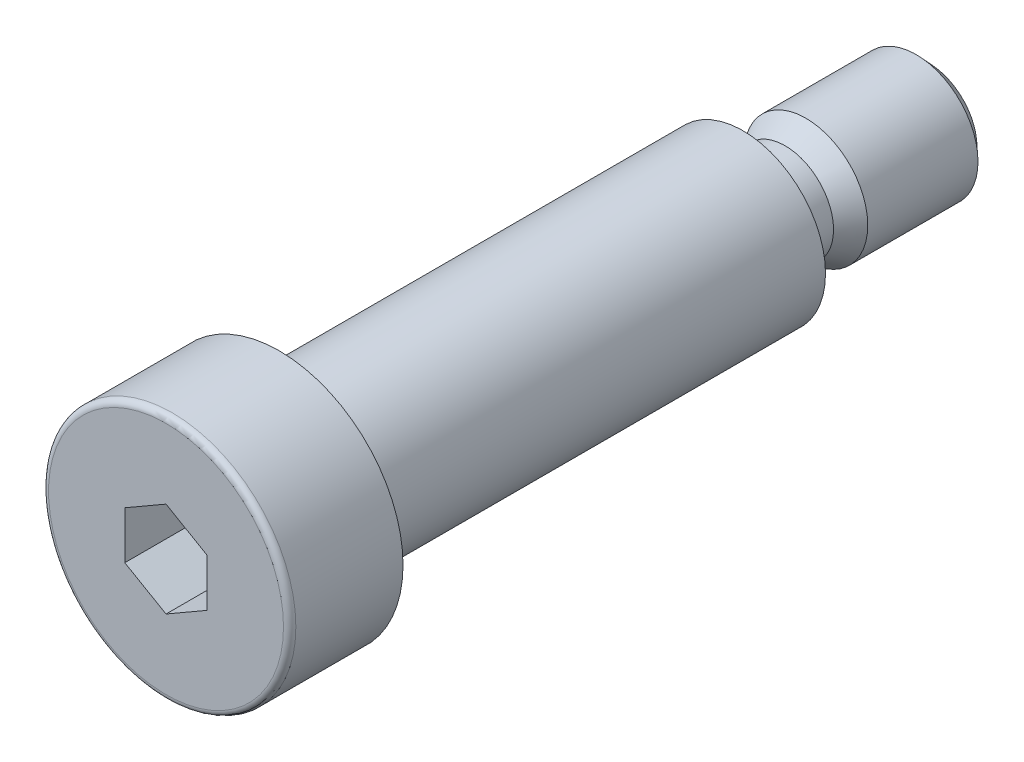
ISO-10303-21;
HEADER;
FILE_DESCRIPTION(('STEP AP214'),'2;1');
FILE_NAME('part.step','',(''),(''),'','','');
FILE_SCHEMA(('AUTOMOTIVE_DESIGN { 1 0 10303 214 1 1 1 1 }'));
ENDSEC;
DATA;
#1=APPLICATION_CONTEXT('core data for automotive mechanical design processes');
#2=APPLICATION_PROTOCOL_DEFINITION('international standard','automotive_design',2000,#1);
#3=PRODUCT_CONTEXT('',#1,'mechanical');
#4=PRODUCT('Part','Part','',(#3));
#5=PRODUCT_RELATED_PRODUCT_CATEGORY('part','',(#4));
#6=PRODUCT_DEFINITION_FORMATION('','',#4);
#7=PRODUCT_DEFINITION_CONTEXT('part definition',#1,'design');
#8=PRODUCT_DEFINITION('design','',#6,#7);
#9=PRODUCT_DEFINITION_SHAPE('','',#8);
#10=(LENGTH_UNIT() NAMED_UNIT(*) SI_UNIT(.MILLI.,.METRE.));
#11=(NAMED_UNIT(*) PLANE_ANGLE_UNIT() SI_UNIT($,.RADIAN.));
#12=(NAMED_UNIT(*) SI_UNIT($,.STERADIAN.) SOLID_ANGLE_UNIT());
#13=UNCERTAINTY_MEASURE_WITH_UNIT(LENGTH_MEASURE(1.E-05),#10,'distance_accuracy_value','');
#14=(GEOMETRIC_REPRESENTATION_CONTEXT(3) GLOBAL_UNCERTAINTY_ASSIGNED_CONTEXT((#13)) GLOBAL_UNIT_ASSIGNED_CONTEXT((#10,
#11,#12)) REPRESENTATION_CONTEXT('',''));
#15=CARTESIAN_POINT('',(0.,0.,0.));
#16=DIRECTION('',(0.,0.,1.));
#17=DIRECTION('',(1.,0.,0.));
#18=AXIS2_PLACEMENT_3D('',#15,#16,#17);
#19=CARTESIAN_POINT('',(0.,0.,33.5));
#20=DIRECTION('',(0.,0.,1.));
#21=DIRECTION('',(1.,0.,0.));
#22=AXIS2_PLACEMENT_3D('',#19,#20,#21);
#23=PLANE('',#22);
#24=CARTESIAN_POINT('',(0.,0.,33.5));
#25=DIRECTION('',(0.,0.,1.));
#26=DIRECTION('',(1.,0.,0.));
#27=AXIS2_PLACEMENT_3D('',#24,#25,#26);
#28=CIRCLE('',#27,11.4);
#29=CARTESIAN_POINT('',(11.4,0.,33.5));
#30=VERTEX_POINT('',#29);
#31=EDGE_CURVE('E42',#30,#30,#28,.T.);
#32=ORIENTED_EDGE('',*,*,#31,.T.);
#33=EDGE_LOOP('',(#32));
#34=FACE_BOUND('',#33,.T.);
#35=DIRECTION('',(0.,1.,0.));
#36=VECTOR('',#35,1.);
#37=CARTESIAN_POINT('',(4.,-2.30940107675851,33.5));
#38=LINE('',#37,#36);
#39=CARTESIAN_POINT('',(4.,-2.30940107675851,33.5));
#40=VERTEX_POINT('',#39);
#41=CARTESIAN_POINT('',(4.,2.3094010767585,33.5));
#42=VERTEX_POINT('',#41);
#43=EDGE_CURVE('E49',#40,#42,#38,.T.);
#44=ORIENTED_EDGE('',*,*,#43,.F.);
#45=DIRECTION('',(0.866025403784439,0.5,0.));
#46=VECTOR('',#45,1.);
#47=CARTESIAN_POINT('',(0.,-4.61880215351701,33.5));
#48=LINE('',#47,#46);
#49=CARTESIAN_POINT('',(0.,-4.61880215351701,33.5));
#50=VERTEX_POINT('',#49);
#51=EDGE_CURVE('E132',#50,#40,#48,.T.);
#52=ORIENTED_EDGE('',*,*,#51,.F.);
#53=DIRECTION('',(0.866025403784439,-0.5,0.));
#54=VECTOR('',#53,1.);
#55=CARTESIAN_POINT('',(-4.,-2.3094010767585,33.5));
#56=LINE('',#55,#54);
#57=CARTESIAN_POINT('',(-4.,-2.3094010767585,33.5));
#58=VERTEX_POINT('',#57);
#59=EDGE_CURVE('E130',#58,#50,#56,.T.);
#60=ORIENTED_EDGE('',*,*,#59,.F.);
#61=DIRECTION('',(0.,-1.,0.));
#62=VECTOR('',#61,1.);
#63=CARTESIAN_POINT('',(-4.,2.30940107675851,33.5));
#64=LINE('',#63,#62);
#65=CARTESIAN_POINT('',(-4.,2.30940107675851,33.5));
#66=VERTEX_POINT('',#65);
#67=EDGE_CURVE('E97',#66,#58,#64,.T.);
#68=ORIENTED_EDGE('',*,*,#67,.F.);
#69=DIRECTION('',(-0.866025403784439,-0.5,0.));
#70=VECTOR('',#69,1.);
#71=CARTESIAN_POINT('',(0.,4.61880215351701,33.5));
#72=LINE('',#71,#70);
#73=CARTESIAN_POINT('',(0.,4.61880215351701,33.5));
#74=VERTEX_POINT('',#73);
#75=EDGE_CURVE('E126',#74,#66,#72,.T.);
#76=ORIENTED_EDGE('',*,*,#75,.F.);
#77=DIRECTION('',(-0.866025403784439,0.5,0.));
#78=VECTOR('',#77,1.);
#79=CARTESIAN_POINT('',(4.,2.3094010767585,33.5));
#80=LINE('',#79,#78);
#81=EDGE_CURVE('E123',#42,#74,#80,.T.);
#82=ORIENTED_EDGE('',*,*,#81,.F.);
#83=EDGE_LOOP('',(#44,#52,#60,#68,#76,#82));
#84=FACE_BOUND('',#83,.T.);
#85=ADVANCED_FACE('F34',(#34,#84),#23,.T.);
#86=CARTESIAN_POINT('',(0.,0.,-40.5));
#87=DIRECTION('',(0.,0.,1.));
#88=DIRECTION('',(1.,0.,0.));
#89=AXIS2_PLACEMENT_3D('',#86,#87,#88);
#90=PLANE('',#89);
#91=CARTESIAN_POINT('',(0.,0.,-40.5));
#92=DIRECTION('',(0.,0.,1.));
#93=DIRECTION('',(1.,0.,0.));
#94=AXIS2_PLACEMENT_3D('',#91,#92,#93);
#95=CIRCLE('',#94,4.7);
#96=CARTESIAN_POINT('',(4.7,0.,-40.5));
#97=VERTEX_POINT('',#96);
#98=EDGE_CURVE('E162',#97,#97,#95,.T.);
#99=ORIENTED_EDGE('',*,*,#98,.F.);
#100=EDGE_LOOP('',(#99));
#101=FACE_BOUND('',#100,.T.);
#102=ADVANCED_FACE('F178',(#101),#90,.F.);
#103=CARTESIAN_POINT('',(0.,0.,-40.5));
#104=DIRECTION('',(0.,0.,1.));
#105=DIRECTION('',(1.,0.,0.));
#106=AXIS2_PLACEMENT_3D('',#103,#104,#105);
#107=CONICAL_SURFACE('',#106,4.7,0.825376850520735);
#108=CARTESIAN_POINT('',(0.,0.,-39.3));
#109=DIRECTION('',(0.,0.,1.));
#110=DIRECTION('',(1.,0.,0.));
#111=AXIS2_PLACEMENT_3D('',#108,#109,#110);
#112=CIRCLE('',#111,6.);
#113=CARTESIAN_POINT('',(6.,0.,-39.3));
#114=VERTEX_POINT('',#113);
#115=EDGE_CURVE('E159',#114,#114,#112,.T.);
#116=ORIENTED_EDGE('',*,*,#115,.F.);
#117=EDGE_LOOP('',(#116));
#118=FACE_BOUND('',#117,.T.);
#119=ORIENTED_EDGE('',*,*,#98,.T.);
#120=EDGE_LOOP('',(#119));
#121=FACE_BOUND('',#120,.T.);
#122=ADVANCED_FACE('F182',(#118,#121),#107,.T.);
#123=CARTESIAN_POINT('',(0.,0.,33.5));
#124=DIRECTION('',(0.,0.,1.));
#125=DIRECTION('',(1.,0.,0.));
#126=AXIS2_PLACEMENT_3D('',#123,#124,#125);
#127=CYLINDRICAL_SURFACE('',#126,6.);
#128=CARTESIAN_POINT('',(0.,0.,-28.6));
#129=DIRECTION('',(0.,0.,1.));
#130=DIRECTION('',(1.,0.,0.));
#131=AXIS2_PLACEMENT_3D('',#128,#129,#130);
#132=CIRCLE('',#131,6.);
#133=CARTESIAN_POINT('',(6.,0.,-28.6));
#134=VERTEX_POINT('',#133);
#135=EDGE_CURVE('E156',#134,#134,#132,.T.);
#136=ORIENTED_EDGE('',*,*,#135,.F.);
#137=EDGE_LOOP('',(#136));
#138=FACE_BOUND('',#137,.T.);
#139=ORIENTED_EDGE('',*,*,#115,.T.);
#140=EDGE_LOOP('',(#139));
#141=FACE_BOUND('',#140,.T.);
#142=ADVANCED_FACE('F188',(#138,#141),#127,.T.);
#143=CARTESIAN_POINT('',(0.,0.,-28.6));
#144=DIRECTION('',(0.,0.,-1.));
#145=DIRECTION('',(-1.,0.,0.));
#146=AXIS2_PLACEMENT_3D('',#143,#144,#145);
#147=CONICAL_SURFACE('',#146,6.,0.571837729916958);
#148=CARTESIAN_POINT('',(0.,0.,-26.58));
#149=DIRECTION('',(0.,0.,1.));
#150=DIRECTION('',(1.,0.,0.));
#151=AXIS2_PLACEMENT_3D('',#148,#149,#150);
#152=CIRCLE('',#151,4.70000000000001);
#153=CARTESIAN_POINT('',(4.70000000000001,0.,-26.58));
#154=VERTEX_POINT('',#153);
#155=EDGE_CURVE('E153',#154,#154,#152,.T.);
#156=ORIENTED_EDGE('',*,*,#155,.F.);
#157=EDGE_LOOP('',(#156));
#158=FACE_BOUND('',#157,.T.);
#159=ORIENTED_EDGE('',*,*,#135,.T.);
#160=EDGE_LOOP('',(#159));
#161=FACE_BOUND('',#160,.T.);
#162=ADVANCED_FACE('F192',(#158,#161),#147,.T.);
#163=CARTESIAN_POINT('',(0.,0.,33.5));
#164=DIRECTION('',(0.,0.,1.));
#165=DIRECTION('',(1.,0.,0.));
#166=AXIS2_PLACEMENT_3D('',#163,#164,#165);
#167=CYLINDRICAL_SURFACE('',#166,4.7);
#168=ORIENTED_EDGE('',*,*,#155,.T.);
#169=EDGE_LOOP('',(#168));
#170=FACE_BOUND('',#169,.T.);
#171=CARTESIAN_POINT('',(0.,0.,-22.5));
#172=DIRECTION('',(0.,0.,1.));
#173=DIRECTION('',(1.,0.,0.));
#174=AXIS2_PLACEMENT_3D('',#171,#172,#173);
#175=CIRCLE('',#174,4.7);
#176=CARTESIAN_POINT('',(4.7,0.,-22.5));
#177=VERTEX_POINT('',#176);
#178=EDGE_CURVE('E150',#177,#177,#175,.T.);
#179=ORIENTED_EDGE('',*,*,#178,.F.);
#180=EDGE_LOOP('',(#179));
#181=FACE_BOUND('',#180,.T.);
#182=ADVANCED_FACE('F196',(#170,#181),#167,.T.);
#183=CARTESIAN_POINT('',(0.,0.,-22.5));
#184=DIRECTION('',(0.,0.,1.));
#185=DIRECTION('',(1.,0.,0.));
#186=AXIS2_PLACEMENT_3D('',#183,#184,#185);
#187=PLANE('',#186);
#188=CARTESIAN_POINT('',(0.,0.,-22.5));
#189=DIRECTION('',(0.,0.,1.));
#190=DIRECTION('',(1.,0.,0.));
#191=AXIS2_PLACEMENT_3D('',#188,#189,#190);
#192=CIRCLE('',#191,7.99999999999999);
#193=CARTESIAN_POINT('',(7.99999999999999,0.,-22.5));
#194=VERTEX_POINT('',#193);
#195=EDGE_CURVE('E147',#194,#194,#192,.T.);
#196=ORIENTED_EDGE('',*,*,#195,.F.);
#197=EDGE_LOOP('',(#196));
#198=FACE_BOUND('',#197,.T.);
#199=ORIENTED_EDGE('',*,*,#178,.T.);
#200=EDGE_LOOP('',(#199));
#201=FACE_BOUND('',#200,.T.);
#202=ADVANCED_FACE('F200',(#198,#201),#187,.F.);
#203=CARTESIAN_POINT('',(0.,0.,33.5));
#204=DIRECTION('',(0.,0.,1.));
#205=DIRECTION('',(1.,0.,0.));
#206=AXIS2_PLACEMENT_3D('',#203,#204,#205);
#207=CYLINDRICAL_SURFACE('',#206,7.99999999999999);
#208=ORIENTED_EDGE('',*,*,#195,.T.);
#209=EDGE_LOOP('',(#208));
#210=FACE_BOUND('',#209,.T.);
#211=CARTESIAN_POINT('',(0.,0.,22.5));
#212=DIRECTION('',(0.,0.,1.));
#213=DIRECTION('',(1.,0.,0.));
#214=AXIS2_PLACEMENT_3D('',#211,#212,#213);
#215=CIRCLE('',#214,7.99999999999999);
#216=CARTESIAN_POINT('',(7.99999999999999,0.,22.5));
#217=VERTEX_POINT('',#216);
#218=EDGE_CURVE('E144',#217,#217,#215,.T.);
#219=ORIENTED_EDGE('',*,*,#218,.F.);
#220=EDGE_LOOP('',(#219));
#221=FACE_BOUND('',#220,.T.);
#222=ADVANCED_FACE('F204',(#210,#221),#207,.T.);
#223=CARTESIAN_POINT('',(0.,0.,22.5));
#224=DIRECTION('',(0.,0.,1.));
#225=DIRECTION('',(1.,0.,0.));
#226=AXIS2_PLACEMENT_3D('',#223,#224,#225);
#227=PLANE('',#226);
#228=CARTESIAN_POINT('',(0.,0.,22.5));
#229=DIRECTION('',(0.,0.,1.));
#230=DIRECTION('',(1.,0.,0.));
#231=AXIS2_PLACEMENT_3D('',#228,#229,#230);
#232=CIRCLE('',#231,12.);
#233=CARTESIAN_POINT('',(12.,0.,22.5));
#234=VERTEX_POINT('',#233);
#235=EDGE_CURVE('E136',#234,#234,#232,.T.);
#236=ORIENTED_EDGE('',*,*,#235,.F.);
#237=EDGE_LOOP('',(#236));
#238=FACE_BOUND('',#237,.T.);
#239=ORIENTED_EDGE('',*,*,#218,.T.);
#240=EDGE_LOOP('',(#239));
#241=FACE_BOUND('',#240,.T.);
#242=ADVANCED_FACE('F208',(#238,#241),#227,.F.);
#243=CARTESIAN_POINT('',(0.,0.,33.5));
#244=DIRECTION('',(0.,0.,1.));
#245=DIRECTION('',(1.,0.,0.));
#246=AXIS2_PLACEMENT_3D('',#243,#244,#245);
#247=CYLINDRICAL_SURFACE('',#246,12.);
#248=CARTESIAN_POINT('',(0.,0.,32.9));
#249=DIRECTION('',(0.,0.,1.));
#250=DIRECTION('',(1.,0.,0.));
#251=AXIS2_PLACEMENT_3D('',#248,#249,#250);
#252=CIRCLE('',#251,12.);
#253=CARTESIAN_POINT('',(12.,0.,32.9));
#254=VERTEX_POINT('',#253);
#255=EDGE_CURVE('E11',#254,#254,#252,.F.);
#256=ORIENTED_EDGE('',*,*,#255,.T.);
#257=EDGE_LOOP('',(#256));
#258=FACE_BOUND('',#257,.T.);
#259=ORIENTED_EDGE('',*,*,#235,.T.);
#260=EDGE_LOOP('',(#259));
#261=FACE_BOUND('',#260,.T.);
#262=ADVANCED_FACE('F212',(#258,#261),#247,.T.);
#263=CARTESIAN_POINT('',(4.,-2.30940107675851,26.9));
#264=DIRECTION('',(1.,0.,0.));
#265=DIRECTION('',(0.,0.,-1.));
#266=AXIS2_PLACEMENT_3D('',#263,#264,#265);
#267=PLANE('',#266);
#268=ORIENTED_EDGE('',*,*,#43,.T.);
#269=DIRECTION('',(0.,0.,1.));
#270=VECTOR('',#269,1.);
#271=CARTESIAN_POINT('',(4.,2.3094010767585,26.9));
#272=LINE('',#271,#270);
#273=CARTESIAN_POINT('',(4.,2.3094010767585,26.9));
#274=VERTEX_POINT('',#273);
#275=EDGE_CURVE('E79',#274,#42,#272,.T.);
#276=ORIENTED_EDGE('',*,*,#275,.F.);
#277=DIRECTION('',(0.,1.,0.));
#278=VECTOR('',#277,1.);
#279=CARTESIAN_POINT('',(4.,-2.30940107675851,26.9));
#280=LINE('',#279,#278);
#281=CARTESIAN_POINT('',(4.,-2.30940107675851,26.9));
#282=VERTEX_POINT('',#281);
#283=EDGE_CURVE('E134',#282,#274,#280,.T.);
#284=ORIENTED_EDGE('',*,*,#283,.F.);
#285=DIRECTION('',(0.,0.,1.));
#286=VECTOR('',#285,1.);
#287=CARTESIAN_POINT('',(4.,-2.30940107675851,26.9));
#288=LINE('',#287,#286);
#289=EDGE_CURVE('E57',#282,#40,#288,.T.);
#290=ORIENTED_EDGE('',*,*,#289,.T.);
#291=EDGE_LOOP('',(#268,#276,#284,#290));
#292=FACE_BOUND('',#291,.T.);
#293=ADVANCED_FACE('F216',(#292),#267,.F.);
#294=CARTESIAN_POINT('',(0.,-4.61880215351701,26.9));
#295=DIRECTION('',(0.5,-0.866025403784439,0.));
#296=DIRECTION('',(0.866025403784439,0.5,0.));
#297=AXIS2_PLACEMENT_3D('',#294,#295,#296);
#298=PLANE('',#297);
#299=ORIENTED_EDGE('',*,*,#51,.T.);
#300=ORIENTED_EDGE('',*,*,#289,.F.);
#301=DIRECTION('',(0.866025403784439,0.5,0.));
#302=VECTOR('',#301,1.);
#303=CARTESIAN_POINT('',(0.,-4.61880215351701,26.9));
#304=LINE('',#303,#302);
#305=CARTESIAN_POINT('',(0.,-4.61880215351701,26.9));
#306=VERTEX_POINT('',#305);
#307=EDGE_CURVE('E109',#306,#282,#304,.T.);
#308=ORIENTED_EDGE('',*,*,#307,.F.);
#309=DIRECTION('',(0.,0.,1.));
#310=VECTOR('',#309,1.);
#311=CARTESIAN_POINT('',(0.,-4.61880215351701,26.9));
#312=LINE('',#311,#310);
#313=EDGE_CURVE('E101',#306,#50,#312,.T.);
#314=ORIENTED_EDGE('',*,*,#313,.T.);
#315=EDGE_LOOP('',(#299,#300,#308,#314));
#316=FACE_BOUND('',#315,.T.);
#317=ADVANCED_FACE('F220',(#316),#298,.F.);
#318=CARTESIAN_POINT('',(-4.,-2.3094010767585,26.9));
#319=DIRECTION('',(-0.5,-0.866025403784439,0.));
#320=DIRECTION('',(0.866025403784439,-0.5,0.));
#321=AXIS2_PLACEMENT_3D('',#318,#319,#320);
#322=PLANE('',#321);
#323=ORIENTED_EDGE('',*,*,#59,.T.);
#324=ORIENTED_EDGE('',*,*,#313,.F.);
#325=DIRECTION('',(0.866025403784439,-0.5,0.));
#326=VECTOR('',#325,1.);
#327=CARTESIAN_POINT('',(-4.,-2.3094010767585,26.9));
#328=LINE('',#327,#326);
#329=CARTESIAN_POINT('',(-4.,-2.3094010767585,26.9));
#330=VERTEX_POINT('',#329);
#331=EDGE_CURVE('E105',#330,#306,#328,.T.);
#332=ORIENTED_EDGE('',*,*,#331,.F.);
#333=DIRECTION('',(0.,0.,1.));
#334=VECTOR('',#333,1.);
#335=CARTESIAN_POINT('',(-4.,-2.3094010767585,26.9));
#336=LINE('',#335,#334);
#337=EDGE_CURVE('E90',#330,#58,#336,.T.);
#338=ORIENTED_EDGE('',*,*,#337,.T.);
#339=EDGE_LOOP('',(#323,#324,#332,#338));
#340=FACE_BOUND('',#339,.T.);
#341=ADVANCED_FACE('F106',(#340),#322,.F.);
#342=CARTESIAN_POINT('',(-4.,2.30940107675851,26.9));
#343=DIRECTION('',(-1.,0.,0.));
#344=DIRECTION('',(0.,-1.,0.));
#345=AXIS2_PLACEMENT_3D('',#342,#343,#344);
#346=PLANE('',#345);
#347=ORIENTED_EDGE('',*,*,#67,.T.);
#348=ORIENTED_EDGE('',*,*,#337,.F.);
#349=DIRECTION('',(0.,-1.,0.));
#350=VECTOR('',#349,1.);
#351=CARTESIAN_POINT('',(-4.,2.30940107675851,26.9));
#352=LINE('',#351,#350);
#353=CARTESIAN_POINT('',(-4.,2.30940107675851,26.9));
#354=VERTEX_POINT('',#353);
#355=EDGE_CURVE('E94',#354,#330,#352,.T.);
#356=ORIENTED_EDGE('',*,*,#355,.F.);
#357=DIRECTION('',(0.,0.,1.));
#358=VECTOR('',#357,1.);
#359=CARTESIAN_POINT('',(-4.,2.30940107675851,26.9));
#360=LINE('',#359,#358);
#361=EDGE_CURVE('E102',#354,#66,#360,.T.);
#362=ORIENTED_EDGE('',*,*,#361,.T.);
#363=EDGE_LOOP('',(#347,#348,#356,#362));
#364=FACE_BOUND('',#363,.T.);
#365=ADVANCED_FACE('F92',(#364),#346,.F.);
#366=CARTESIAN_POINT('',(0.,4.61880215351701,26.9));
#367=DIRECTION('',(-0.5,0.866025403784439,0.));
#368=DIRECTION('',(-0.866025403784439,-0.5,0.));
#369=AXIS2_PLACEMENT_3D('',#366,#367,#368);
#370=PLANE('',#369);
#371=ORIENTED_EDGE('',*,*,#75,.T.);
#372=ORIENTED_EDGE('',*,*,#361,.F.);
#373=DIRECTION('',(-0.866025403784439,-0.5,0.));
#374=VECTOR('',#373,1.);
#375=CARTESIAN_POINT('',(0.,4.61880215351701,26.9));
#376=LINE('',#375,#374);
#377=CARTESIAN_POINT('',(0.,4.61880215351701,26.9));
#378=VERTEX_POINT('',#377);
#379=EDGE_CURVE('E115',#378,#354,#376,.T.);
#380=ORIENTED_EDGE('',*,*,#379,.F.);
#381=DIRECTION('',(0.,0.,1.));
#382=VECTOR('',#381,1.);
#383=CARTESIAN_POINT('',(0.,4.61880215351701,26.9));
#384=LINE('',#383,#382);
#385=EDGE_CURVE('E139',#378,#74,#384,.T.);
#386=ORIENTED_EDGE('',*,*,#385,.T.);
#387=EDGE_LOOP('',(#371,#372,#380,#386));
#388=FACE_BOUND('',#387,.T.);
#389=ADVANCED_FACE('F223',(#388),#370,.F.);
#390=CARTESIAN_POINT('',(4.,2.3094010767585,26.9));
#391=DIRECTION('',(0.5,0.866025403784439,0.));
#392=DIRECTION('',(-0.866025403784439,0.5,0.));
#393=AXIS2_PLACEMENT_3D('',#390,#391,#392);
#394=PLANE('',#393);
#395=ORIENTED_EDGE('',*,*,#81,.T.);
#396=ORIENTED_EDGE('',*,*,#385,.F.);
#397=DIRECTION('',(-0.866025403784439,0.5,0.));
#398=VECTOR('',#397,1.);
#399=CARTESIAN_POINT('',(4.,2.3094010767585,26.9));
#400=LINE('',#399,#398);
#401=EDGE_CURVE('E117',#274,#378,#400,.T.);
#402=ORIENTED_EDGE('',*,*,#401,.F.);
#403=ORIENTED_EDGE('',*,*,#275,.T.);
#404=EDGE_LOOP('',(#395,#396,#402,#403));
#405=FACE_BOUND('',#404,.T.);
#406=ADVANCED_FACE('F174',(#405),#394,.F.);
#407=CARTESIAN_POINT('',(0.,0.,26.9));
#408=DIRECTION('',(0.,0.,1.));
#409=DIRECTION('',(1.,0.,0.));
#410=AXIS2_PLACEMENT_3D('',#407,#408,#409);
#411=PLANE('',#410);
#412=ORIENTED_EDGE('',*,*,#283,.T.);
#413=ORIENTED_EDGE('',*,*,#401,.T.);
#414=ORIENTED_EDGE('',*,*,#379,.T.);
#415=ORIENTED_EDGE('',*,*,#355,.T.);
#416=ORIENTED_EDGE('',*,*,#331,.T.);
#417=ORIENTED_EDGE('',*,*,#307,.T.);
#418=EDGE_LOOP('',(#412,#413,#414,#415,#416,#417));
#419=FACE_BOUND('',#418,.T.);
#420=ADVANCED_FACE('F112',(#419),#411,.T.);
#421=CARTESIAN_POINT('',(0.,0.,32.9));
#422=DIRECTION('',(0.,0.,1.));
#423=DIRECTION('',(1.,0.,0.));
#424=AXIS2_PLACEMENT_3D('',#421,#422,#423);
#425=TOROIDAL_SURFACE('',#424,11.4,0.6);
#426=ORIENTED_EDGE('',*,*,#255,.F.);
#427=EDGE_LOOP('',(#426));
#428=FACE_BOUND('',#427,.T.);
#429=ORIENTED_EDGE('',*,*,#31,.F.);
#430=EDGE_LOOP('',(#429));
#431=FACE_BOUND('',#430,.T.);
#432=ADVANCED_FACE('F36',(#428,#431),#425,.T.);
#433=CLOSED_SHELL('',(#85,#102,#122,#142,#162,#182,#202,#222,#242,#262,#293,#317,#341,#365,#389,
#406,#420,#432));
#434=MANIFOLD_SOLID_BREP('B2',#433);
#435=ADVANCED_BREP_SHAPE_REPRESENTATION('',(#18,#434),#14);
#436=SHAPE_DEFINITION_REPRESENTATION(#9,#435);
ENDSEC;
END-ISO-10303-21;
